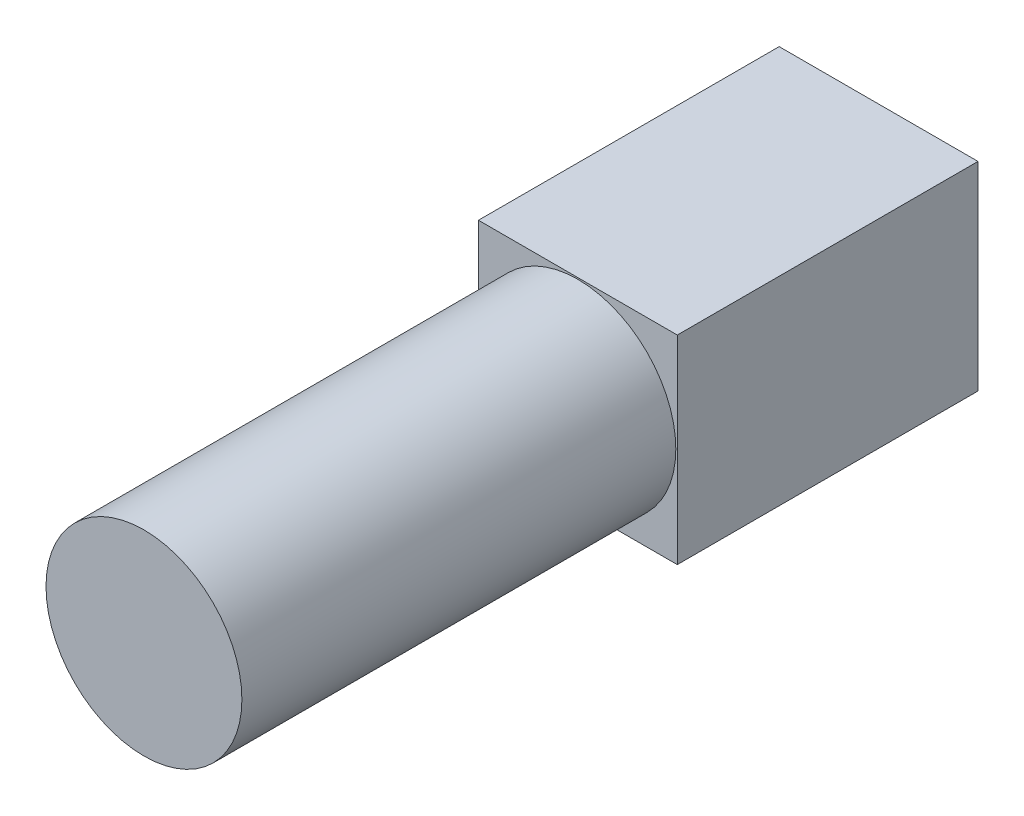
ISO-10303-21;
HEADER;
FILE_DESCRIPTION(('STEP AP214'),'2;1');
FILE_NAME('part.step','',(''),(''),'','','');
FILE_SCHEMA(('AUTOMOTIVE_DESIGN { 1 0 10303 214 1 1 1 1 }'));
ENDSEC;
DATA;
#1=APPLICATION_CONTEXT('core data for automotive mechanical design processes');
#2=APPLICATION_PROTOCOL_DEFINITION('international standard','automotive_design',2000,#1);
#3=PRODUCT_CONTEXT('',#1,'mechanical');
#4=PRODUCT('Part','Part','',(#3));
#5=PRODUCT_RELATED_PRODUCT_CATEGORY('part','',(#4));
#6=PRODUCT_DEFINITION_FORMATION('','',#4);
#7=PRODUCT_DEFINITION_CONTEXT('part definition',#1,'design');
#8=PRODUCT_DEFINITION('design','',#6,#7);
#9=PRODUCT_DEFINITION_SHAPE('','',#8);
#10=(LENGTH_UNIT() NAMED_UNIT(*) SI_UNIT(.MILLI.,.METRE.));
#11=(NAMED_UNIT(*) PLANE_ANGLE_UNIT() SI_UNIT($,.RADIAN.));
#12=(NAMED_UNIT(*) SI_UNIT($,.STERADIAN.) SOLID_ANGLE_UNIT());
#13=UNCERTAINTY_MEASURE_WITH_UNIT(LENGTH_MEASURE(1.E-05),#10,'distance_accuracy_value','');
#14=(GEOMETRIC_REPRESENTATION_CONTEXT(3) GLOBAL_UNCERTAINTY_ASSIGNED_CONTEXT((#13)) GLOBAL_UNIT_ASSIGNED_CONTEXT((#10,
#11,#12)) REPRESENTATION_CONTEXT('',''));
#15=CARTESIAN_POINT('',(0.,0.,0.));
#16=DIRECTION('',(0.,0.,1.));
#17=DIRECTION('',(1.,0.,0.));
#18=AXIS2_PLACEMENT_3D('',#15,#16,#17);
#19=CARTESIAN_POINT('',(0.,0.,12.28));
#20=DIRECTION('',(0.,0.,-1.));
#21=DIRECTION('',(-1.,0.,0.));
#22=AXIS2_PLACEMENT_3D('',#19,#20,#21);
#23=PLANE('',#22);
#24=DIRECTION('',(0.,1.,0.));
#25=VECTOR('',#24,1.);
#26=CARTESIAN_POINT('',(4.06,-4.06,12.28));
#27=LINE('',#26,#25);
#28=CARTESIAN_POINT('',(4.06,-4.06,12.28));
#29=VERTEX_POINT('',#28);
#30=CARTESIAN_POINT('',(4.06,4.06,12.28));
#31=VERTEX_POINT('',#30);
#32=EDGE_CURVE('E87',#29,#31,#27,.T.);
#33=ORIENTED_EDGE('',*,*,#32,.T.);
#34=DIRECTION('',(-1.,0.,0.));
#35=VECTOR('',#34,1.);
#36=CARTESIAN_POINT('',(-4.06,4.06,12.28));
#37=LINE('',#36,#35);
#38=CARTESIAN_POINT('',(-4.06,4.06,12.28));
#39=VERTEX_POINT('',#38);
#40=EDGE_CURVE('E82',#31,#39,#37,.T.);
#41=ORIENTED_EDGE('',*,*,#40,.T.);
#42=DIRECTION('',(0.,-1.,0.));
#43=VECTOR('',#42,1.);
#44=CARTESIAN_POINT('',(-4.06,-4.06,12.28));
#45=LINE('',#44,#43);
#46=CARTESIAN_POINT('',(-4.06,-4.06,12.28));
#47=VERTEX_POINT('',#46);
#48=EDGE_CURVE('E85',#39,#47,#45,.T.);
#49=ORIENTED_EDGE('',*,*,#48,.T.);
#50=DIRECTION('',(1.,0.,0.));
#51=VECTOR('',#50,1.);
#52=CARTESIAN_POINT('',(-4.06,-4.06,12.28));
#53=LINE('',#52,#51);
#54=EDGE_CURVE('E51',#47,#29,#53,.T.);
#55=ORIENTED_EDGE('',*,*,#54,.T.);
#56=EDGE_LOOP('',(#33,#41,#49,#55));
#57=FACE_BOUND('',#56,.T.);
#58=CARTESIAN_POINT('',(0.,0.,12.28));
#59=DIRECTION('',(0.,0.,-1.));
#60=DIRECTION('',(-1.,0.,0.));
#61=AXIS2_PLACEMENT_3D('',#58,#59,#60);
#62=CIRCLE('',#61,4.);
#63=CARTESIAN_POINT('',(-4.,0.,12.28));
#64=VERTEX_POINT('',#63);
#65=EDGE_CURVE('E11',#64,#64,#62,.F.);
#66=ORIENTED_EDGE('',*,*,#65,.F.);
#67=EDGE_LOOP('',(#66));
#68=FACE_BOUND('',#67,.T.);
#69=ADVANCED_FACE('F33',(#57,#68),#23,.F.);
#70=CARTESIAN_POINT('',(4.06,-4.06,12.28));
#71=DIRECTION('',(-1.,0.,0.));
#72=DIRECTION('',(0.,0.,1.));
#73=AXIS2_PLACEMENT_3D('',#70,#71,#72);
#74=PLANE('',#73);
#75=DIRECTION('',(0.,1.,0.));
#76=VECTOR('',#75,1.);
#77=CARTESIAN_POINT('',(4.06,-4.06,0.));
#78=LINE('',#77,#76);
#79=CARTESIAN_POINT('',(4.06,-4.06,0.));
#80=VERTEX_POINT('',#79);
#81=CARTESIAN_POINT('',(4.06,4.06,0.));
#82=VERTEX_POINT('',#81);
#83=EDGE_CURVE('E100',#80,#82,#78,.T.);
#84=ORIENTED_EDGE('',*,*,#83,.T.);
#85=DIRECTION('',(0.,0.,-1.));
#86=VECTOR('',#85,1.);
#87=CARTESIAN_POINT('',(4.06,4.06,12.28));
#88=LINE('',#87,#86);
#89=EDGE_CURVE('E37',#31,#82,#88,.T.);
#90=ORIENTED_EDGE('',*,*,#89,.F.);
#91=ORIENTED_EDGE('',*,*,#32,.F.);
#92=DIRECTION('',(0.,0.,-1.));
#93=VECTOR('',#92,1.);
#94=CARTESIAN_POINT('',(4.06,-4.06,12.28));
#95=LINE('',#94,#93);
#96=EDGE_CURVE('E96',#29,#80,#95,.T.);
#97=ORIENTED_EDGE('',*,*,#96,.T.);
#98=EDGE_LOOP('',(#84,#90,#91,#97));
#99=FACE_BOUND('',#98,.T.);
#100=ADVANCED_FACE('F35',(#99),#74,.F.);
#101=CARTESIAN_POINT('',(-4.06,4.06,12.28));
#102=DIRECTION('',(0.,-1.,0.));
#103=DIRECTION('',(0.,0.,-1.));
#104=AXIS2_PLACEMENT_3D('',#101,#102,#103);
#105=PLANE('',#104);
#106=DIRECTION('',(-1.,0.,0.));
#107=VECTOR('',#106,1.);
#108=CARTESIAN_POINT('',(-4.06,4.06,0.));
#109=LINE('',#108,#107);
#110=CARTESIAN_POINT('',(-4.06,4.06,0.));
#111=VERTEX_POINT('',#110);
#112=EDGE_CURVE('E92',#82,#111,#109,.T.);
#113=ORIENTED_EDGE('',*,*,#112,.T.);
#114=DIRECTION('',(0.,0.,-1.));
#115=VECTOR('',#114,1.);
#116=CARTESIAN_POINT('',(-4.06,4.06,12.28));
#117=LINE('',#116,#115);
#118=EDGE_CURVE('E90',#39,#111,#117,.T.);
#119=ORIENTED_EDGE('',*,*,#118,.F.);
#120=ORIENTED_EDGE('',*,*,#40,.F.);
#121=ORIENTED_EDGE('',*,*,#89,.T.);
#122=EDGE_LOOP('',(#113,#119,#120,#121));
#123=FACE_BOUND('',#122,.T.);
#124=ADVANCED_FACE('F91',(#123),#105,.F.);
#125=CARTESIAN_POINT('',(-4.06,-4.06,12.28));
#126=DIRECTION('',(1.,0.,0.));
#127=DIRECTION('',(0.,0.,-1.));
#128=AXIS2_PLACEMENT_3D('',#125,#126,#127);
#129=PLANE('',#128);
#130=DIRECTION('',(0.,-1.,0.));
#131=VECTOR('',#130,1.);
#132=CARTESIAN_POINT('',(-4.06,-4.06,0.));
#133=LINE('',#132,#131);
#134=CARTESIAN_POINT('',(-4.06,-4.06,0.));
#135=VERTEX_POINT('',#134);
#136=EDGE_CURVE('E68',#111,#135,#133,.T.);
#137=ORIENTED_EDGE('',*,*,#136,.T.);
#138=DIRECTION('',(0.,0.,-1.));
#139=VECTOR('',#138,1.);
#140=CARTESIAN_POINT('',(-4.06,-4.06,12.28));
#141=LINE('',#140,#139);
#142=EDGE_CURVE('E93',#47,#135,#141,.T.);
#143=ORIENTED_EDGE('',*,*,#142,.F.);
#144=ORIENTED_EDGE('',*,*,#48,.F.);
#145=ORIENTED_EDGE('',*,*,#118,.T.);
#146=EDGE_LOOP('',(#137,#143,#144,#145));
#147=FACE_BOUND('',#146,.T.);
#148=ADVANCED_FACE('F94',(#147),#129,.F.);
#149=CARTESIAN_POINT('',(-4.06,-4.06,12.28));
#150=DIRECTION('',(0.,1.,0.));
#151=DIRECTION('',(0.,0.,1.));
#152=AXIS2_PLACEMENT_3D('',#149,#150,#151);
#153=PLANE('',#152);
#154=DIRECTION('',(1.,0.,0.));
#155=VECTOR('',#154,1.);
#156=CARTESIAN_POINT('',(-4.06,-4.06,0.));
#157=LINE('',#156,#155);
#158=EDGE_CURVE('E74',#135,#80,#157,.T.);
#159=ORIENTED_EDGE('',*,*,#158,.T.);
#160=ORIENTED_EDGE('',*,*,#96,.F.);
#161=ORIENTED_EDGE('',*,*,#54,.F.);
#162=ORIENTED_EDGE('',*,*,#142,.T.);
#163=EDGE_LOOP('',(#159,#160,#161,#162));
#164=FACE_BOUND('',#163,.T.);
#165=ADVANCED_FACE('F108',(#164),#153,.F.);
#166=CARTESIAN_POINT('',(0.,0.,0.));
#167=DIRECTION('',(0.,0.,-1.));
#168=DIRECTION('',(-1.,0.,0.));
#169=AXIS2_PLACEMENT_3D('',#166,#167,#168);
#170=PLANE('',#169);
#171=ORIENTED_EDGE('',*,*,#83,.F.);
#172=ORIENTED_EDGE('',*,*,#158,.F.);
#173=ORIENTED_EDGE('',*,*,#136,.F.);
#174=ORIENTED_EDGE('',*,*,#112,.F.);
#175=EDGE_LOOP('',(#171,#172,#173,#174));
#176=FACE_BOUND('',#175,.T.);
#177=ADVANCED_FACE('F111',(#176),#170,.T.);
#178=CARTESIAN_POINT('',(0.,0.,30.));
#179=DIRECTION('',(0.,0.,-1.));
#180=DIRECTION('',(-1.,0.,0.));
#181=AXIS2_PLACEMENT_3D('',#178,#179,#180);
#182=CYLINDRICAL_SURFACE('',#181,4.);
#183=CARTESIAN_POINT('',(0.,0.,30.));
#184=DIRECTION('',(0.,0.,1.));
#185=DIRECTION('',(1.,0.,0.));
#186=AXIS2_PLACEMENT_3D('',#183,#184,#185);
#187=CIRCLE('',#186,4.);
#188=CARTESIAN_POINT('',(4.,0.,30.));
#189=VERTEX_POINT('',#188);
#190=EDGE_CURVE('E103',#189,#189,#187,.T.);
#191=ORIENTED_EDGE('',*,*,#190,.F.);
#192=EDGE_LOOP('',(#191));
#193=FACE_BOUND('',#192,.T.);
#194=ORIENTED_EDGE('',*,*,#65,.T.);
#195=EDGE_LOOP('',(#194));
#196=FACE_BOUND('',#195,.T.);
#197=ADVANCED_FACE('F119',(#193,#196),#182,.T.);
#198=CARTESIAN_POINT('',(0.,0.,30.));
#199=DIRECTION('',(0.,0.,1.));
#200=DIRECTION('',(1.,0.,0.));
#201=AXIS2_PLACEMENT_3D('',#198,#199,#200);
#202=PLANE('',#201);
#203=ORIENTED_EDGE('',*,*,#190,.T.);
#204=EDGE_LOOP('',(#203));
#205=FACE_BOUND('',#204,.T.);
#206=ADVANCED_FACE('F117',(#205),#202,.T.);
#207=CLOSED_SHELL('',(#69,#100,#124,#148,#165,#177,#197,#206));
#208=MANIFOLD_SOLID_BREP('B2',#207);
#209=ADVANCED_BREP_SHAPE_REPRESENTATION('',(#18,#208),#14);
#210=SHAPE_DEFINITION_REPRESENTATION(#9,#209);
ENDSEC;
END-ISO-10303-21;
